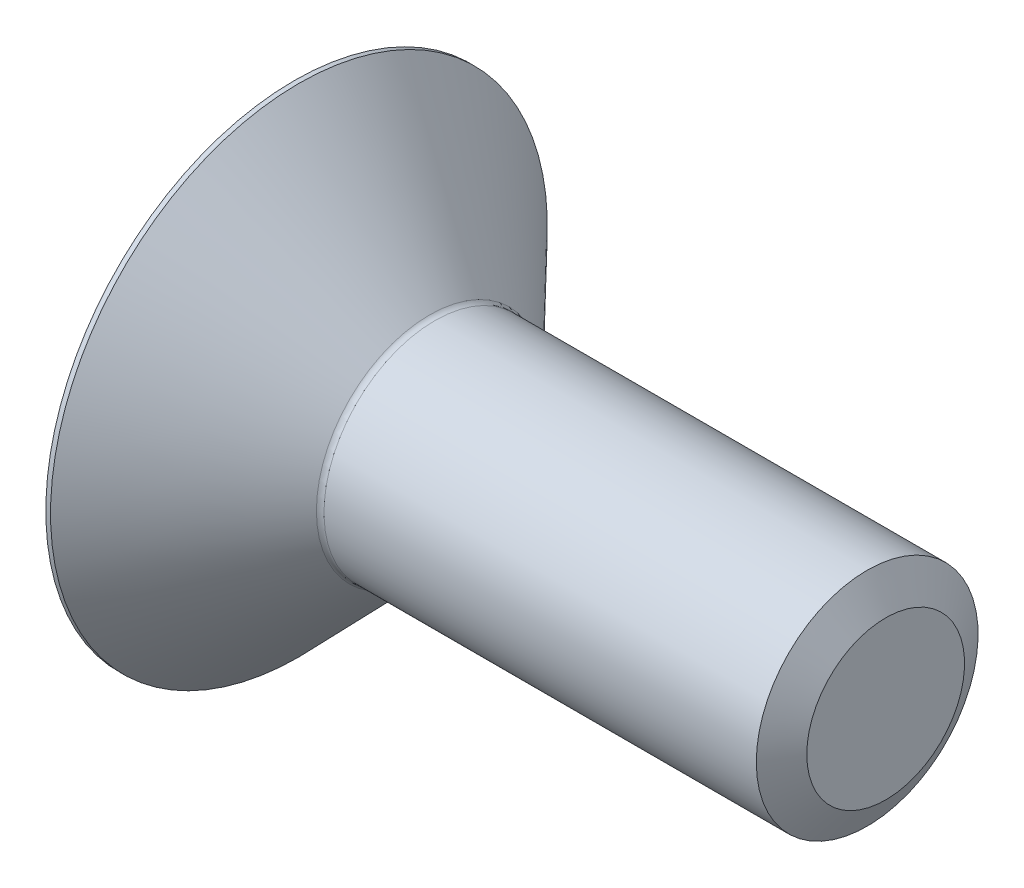
ISO-10303-21;
HEADER;
FILE_DESCRIPTION(('STEP AP214'),'2;1');
FILE_NAME('part.step','',(''),(''),'','','');
FILE_SCHEMA(('AUTOMOTIVE_DESIGN { 1 0 10303 214 1 1 1 1 }'));
ENDSEC;
DATA;
#1=APPLICATION_CONTEXT('core data for automotive mechanical design processes');
#2=APPLICATION_PROTOCOL_DEFINITION('international standard','automotive_design',2000,#1);
#3=PRODUCT_CONTEXT('',#1,'mechanical');
#4=PRODUCT('Part','Part','',(#3));
#5=PRODUCT_RELATED_PRODUCT_CATEGORY('part','',(#4));
#6=PRODUCT_DEFINITION_FORMATION('','',#4);
#7=PRODUCT_DEFINITION_CONTEXT('part definition',#1,'design');
#8=PRODUCT_DEFINITION('design','',#6,#7);
#9=PRODUCT_DEFINITION_SHAPE('','',#8);
#10=(LENGTH_UNIT() NAMED_UNIT(*) SI_UNIT(.MILLI.,.METRE.));
#11=(NAMED_UNIT(*) PLANE_ANGLE_UNIT() SI_UNIT($,.RADIAN.));
#12=(NAMED_UNIT(*) SI_UNIT($,.STERADIAN.) SOLID_ANGLE_UNIT());
#13=UNCERTAINTY_MEASURE_WITH_UNIT(LENGTH_MEASURE(1.E-05),#10,'distance_accuracy_value','');
#14=(GEOMETRIC_REPRESENTATION_CONTEXT(3) GLOBAL_UNCERTAINTY_ASSIGNED_CONTEXT((#13)) GLOBAL_UNIT_ASSIGNED_CONTEXT((#10,
#11,#12)) REPRESENTATION_CONTEXT('',''));
#15=CARTESIAN_POINT('',(0.,0.,0.));
#16=DIRECTION('',(0.,0.,1.));
#17=DIRECTION('',(1.,0.,0.));
#18=AXIS2_PLACEMENT_3D('',#15,#16,#17);
#19=CARTESIAN_POINT('',(0.,0.,0.));
#20=DIRECTION('',(1.,0.,0.));
#21=DIRECTION('',(0.,1.,0.));
#22=AXIS2_PLACEMENT_3D('',#19,#20,#21);
#23=CYLINDRICAL_SURFACE('',#22,1.5);
#24=CARTESIAN_POINT('',(-6.09755251837904,0.,0.));
#25=DIRECTION('',(1.,0.,0.));
#26=DIRECTION('',(0.,1.,0.));
#27=AXIS2_PLACEMENT_3D('',#24,#25,#26);
#28=CIRCLE('',#27,1.5);
#29=CARTESIAN_POINT('',(-6.09755251837904,1.5,0.));
#30=VERTEX_POINT('',#29);
#31=EDGE_CURVE('E134',#30,#30,#28,.T.);
#32=ORIENTED_EDGE('',*,*,#31,.T.);
#33=EDGE_LOOP('',(#32));
#34=FACE_BOUND('',#33,.T.);
#35=CARTESIAN_POINT('',(-0.25,0.,0.));
#36=DIRECTION('',(-1.,0.,0.));
#37=DIRECTION('',(0.,0.,1.));
#38=AXIS2_PLACEMENT_3D('',#35,#36,#37);
#39=CIRCLE('',#38,1.5);
#40=CARTESIAN_POINT('',(-0.25,0.,1.5));
#41=VERTEX_POINT('',#40);
#42=EDGE_CURVE('E322',#41,#41,#39,.T.);
#43=ORIENTED_EDGE('',*,*,#42,.T.);
#44=EDGE_LOOP('',(#43));
#45=FACE_BOUND('',#44,.T.);
#46=ADVANCED_FACE('F47',(#34,#45),#23,.T.);
#47=CARTESIAN_POINT('',(-8.,3.36,0.));
#48=DIRECTION('',(-1.,0.,0.));
#49=DIRECTION('',(0.,-1.,0.));
#50=AXIS2_PLACEMENT_3D('',#47,#48,#49);
#51=PLANE('',#50);
#52=CARTESIAN_POINT('',(-8.,0.,0.));
#53=DIRECTION('',(1.,0.,0.));
#54=DIRECTION('',(0.,1.,0.));
#55=AXIS2_PLACEMENT_3D('',#52,#53,#54);
#56=CIRCLE('',#55,3.36);
#57=CARTESIAN_POINT('',(-8.,3.36,0.));
#58=VERTEX_POINT('',#57);
#59=EDGE_CURVE('E225',#58,#58,#56,.T.);
#60=ORIENTED_EDGE('',*,*,#59,.F.);
#61=EDGE_LOOP('',(#60));
#62=FACE_BOUND('',#61,.T.);
#63=CARTESIAN_POINT('',(-8.,0.,0.));
#64=DIRECTION('',(-1.,0.,0.));
#65=DIRECTION('',(0.,-1.,0.));
#66=AXIS2_PLACEMENT_3D('',#63,#64,#65);
#67=CIRCLE('',#66,1.15470053837925);
#68=CARTESIAN_POINT('',(-8.,-0.577350269189627,1.));
#69=VERTEX_POINT('',#68);
#70=CARTESIAN_POINT('',(-8.,-1.15470053837925,0.));
#71=VERTEX_POINT('',#70);
#72=EDGE_CURVE('E51',#69,#71,#67,.F.);
#73=ORIENTED_EDGE('',*,*,#72,.T.);
#74=CARTESIAN_POINT('',(-8.,-0.577350269189627,-1.));
#75=VERTEX_POINT('',#74);
#76=EDGE_CURVE('E11',#71,#75,#67,.F.);
#77=ORIENTED_EDGE('',*,*,#76,.T.);
#78=CARTESIAN_POINT('',(-8.,0.577350269189627,-0.999999999999999));
#79=VERTEX_POINT('',#78);
#80=EDGE_CURVE('E56',#75,#79,#67,.F.);
#81=ORIENTED_EDGE('',*,*,#80,.T.);
#82=CARTESIAN_POINT('',(-8.,1.15470053837925,0.));
#83=VERTEX_POINT('',#82);
#84=EDGE_CURVE('E121',#79,#83,#67,.F.);
#85=ORIENTED_EDGE('',*,*,#84,.T.);
#86=CARTESIAN_POINT('',(-8.,0.,0.));
#87=DIRECTION('',(-1.,0.,0.));
#88=DIRECTION('',(0.,0.,1.));
#89=AXIS2_PLACEMENT_3D('',#86,#87,#88);
#90=CIRCLE('',#89,1.15470053837925);
#91=CARTESIAN_POINT('',(-8.,0.577350269189629,1.));
#92=VERTEX_POINT('',#91);
#93=EDGE_CURVE('E106',#92,#83,#90,.T.);
#94=ORIENTED_EDGE('',*,*,#93,.F.);
#95=EDGE_CURVE('E115',#92,#69,#67,.F.);
#96=ORIENTED_EDGE('',*,*,#95,.T.);
#97=EDGE_LOOP('',(#73,#77,#81,#85,#94,#96));
#98=FACE_BOUND('',#97,.T.);
#99=ADVANCED_FACE('F122',(#62,#98),#51,.T.);
#100=CARTESIAN_POINT('',(0.,0.,0.));
#101=DIRECTION('',(1.,0.,0.));
#102=DIRECTION('',(0.,1.,0.));
#103=AXIS2_PLACEMENT_3D('',#100,#101,#102);
#104=CYLINDRICAL_SURFACE('',#103,3.36);
#105=ORIENTED_EDGE('',*,*,#59,.T.);
#106=EDGE_LOOP('',(#105));
#107=FACE_BOUND('',#106,.T.);
#108=CARTESIAN_POINT('',(-7.93618112114115,0.,0.));
#109=DIRECTION('',(1.,0.,0.));
#110=DIRECTION('',(0.,1.,0.));
#111=AXIS2_PLACEMENT_3D('',#108,#109,#110);
#112=CIRCLE('',#111,3.36);
#113=CARTESIAN_POINT('',(-7.93618112114115,3.36,0.));
#114=VERTEX_POINT('',#113);
#115=EDGE_CURVE('E227',#114,#114,#112,.T.);
#116=ORIENTED_EDGE('',*,*,#115,.F.);
#117=EDGE_LOOP('',(#116));
#118=FACE_BOUND('',#117,.T.);
#119=ADVANCED_FACE('F213',(#107,#118),#104,.T.);
#120=CARTESIAN_POINT('',(-6.1694864984129,0.,0.));
#121=DIRECTION('',(-1.,0.,0.));
#122=DIRECTION('',(0.,-1.,0.));
#123=AXIS2_PLACEMENT_3D('',#120,#121,#122);
#124=CONICAL_SURFACE('',#123,1.5305341629541,0.802851455917394);
#125=ORIENTED_EDGE('',*,*,#115,.T.);
#126=EDGE_LOOP('',(#125));
#127=FACE_BOUND('',#126,.T.);
#128=CARTESIAN_POINT('',(-6.1694864984129,0.,0.));
#129=DIRECTION('',(1.,0.,0.));
#130=DIRECTION('',(0.,1.,0.));
#131=AXIS2_PLACEMENT_3D('',#128,#129,#130);
#132=CIRCLE('',#131,1.5305341629541);
#133=CARTESIAN_POINT('',(-6.1694864984129,1.5305341629541,0.));
#134=VERTEX_POINT('',#133);
#135=EDGE_CURVE('E231',#134,#134,#132,.T.);
#136=ORIENTED_EDGE('',*,*,#135,.F.);
#137=EDGE_LOOP('',(#136));
#138=FACE_BOUND('',#137,.T.);
#139=ADVANCED_FACE('F209',(#127,#138),#124,.T.);
#140=CARTESIAN_POINT('',(-6.09755251837904,0.,0.));
#141=DIRECTION('',(1.,0.,0.));
#142=DIRECTION('',(0.,1.,0.));
#143=AXIS2_PLACEMENT_3D('',#140,#141,#142);
#144=TOROIDAL_SURFACE('',#143,1.6,0.0999999999999989);
#145=ORIENTED_EDGE('',*,*,#135,.T.);
#146=EDGE_LOOP('',(#145));
#147=FACE_BOUND('',#146,.T.);
#148=ORIENTED_EDGE('',*,*,#31,.F.);
#149=EDGE_LOOP('',(#148));
#150=FACE_BOUND('',#149,.T.);
#151=ADVANCED_FACE('F205',(#147,#150),#144,.F.);
#152=CARTESIAN_POINT('',(-7.7,0.,0.));
#153=DIRECTION('',(-1.,0.,0.));
#154=DIRECTION('',(0.,0.,1.));
#155=AXIS2_PLACEMENT_3D('',#152,#153,#154);
#156=CONICAL_SURFACE('',#155,0.,1.31660847419537);
#157=CARTESIAN_POINT('',(-8.00003000449955,-0.577234799135788,1.0002));
#158=CARTESIAN_POINT('',(-7.99379291920422,-0.601225021738599,0.958647715567044));
#159=CARTESIAN_POINT('',(-7.98813137861672,-0.625256195021441,0.917024502475671));
#160=CARTESIAN_POINT('',(-7.97818542172232,-0.67339838633044,0.833639781140784));
#161=CARTESIAN_POINT('',(-7.9739015302713,-0.697509431260084,0.791878226299064));
#162=CARTESIAN_POINT('',(-7.96695890316674,-0.745673772514855,0.708455140132714));
#163=CARTESIAN_POINT('',(-7.9642923745456,-0.769726780462717,0.66679410829216));
#164=CARTESIAN_POINT('',(-7.96071689299408,-0.817861664223349,0.583422044002323));
#165=CARTESIAN_POINT('',(-7.95980762113533,-0.841943534003894,0.541711022001162));
#166=CARTESIAN_POINT('',(-7.95980762113533,-0.890107273564984,0.458288977998839));
#167=CARTESIAN_POINT('',(-7.96071689299408,-0.914189143345529,0.416577955997678));
#168=CARTESIAN_POINT('',(-7.9642923745456,-0.962324027106161,0.333205891707841));
#169=CARTESIAN_POINT('',(-7.96695890316674,-0.986377035054023,0.291544859867286));
#170=CARTESIAN_POINT('',(-7.9739015302713,-1.03454137630879,0.208121773700937));
#171=CARTESIAN_POINT('',(-7.97818542172232,-1.05865242123844,0.166360218859216));
#172=CARTESIAN_POINT('',(-7.98813137861672,-1.10679461254744,0.0829754975243295));
#173=CARTESIAN_POINT('',(-7.99379291920422,-1.13082578583028,0.0413522844329567));
#174=CARTESIAN_POINT('',(-8.00003000449955,-1.15481600843309,-0.000199999999999094));
#175=B_SPLINE_CURVE_WITH_KNOTS('',3,(#157,#158,#159,#160,#161,#162,#163,#164,#165,#166,#167,
#168,#169,#170,#171,#172,#173,#174),.UNSPECIFIED.,.F.,.F.,(4,2,2,2,2,2,2,2,4),(0.,
0.145159524820138,0.290374287087485,0.434883682122849,0.57936684736763,0.723850012612411,
0.868359407647776,1.01357416991512,1.15873369473526),.UNSPECIFIED.);
#176=EDGE_CURVE('E140',#69,#71,#175,.T.);
#177=ORIENTED_EDGE('',*,*,#176,.T.);
#178=ORIENTED_EDGE('',*,*,#72,.F.);
#179=EDGE_LOOP('',(#177,#178));
#180=FACE_BOUND('',#179,.T.);
#181=ADVANCED_FACE('F208',(#180),#156,.F.);
#182=CARTESIAN_POINT('',(-8.17013380617567,-1.50813004503231,1.));
#183=CARTESIAN_POINT('',(-8.16035504345823,-1.46296169551439,1.));
#184=CARTESIAN_POINT('',(-8.15070106343194,-1.41776633015547,1.));
#185=CARTESIAN_POINT('',(-8.13170572494957,-1.32730802004726,1.));
#186=CARTESIAN_POINT('',(-8.12236437980433,-1.28204507250605,1.));
#187=CARTESIAN_POINT('',(-8.094887707109,-1.1460540932135,1.));
#188=CARTESIAN_POINT('',(-8.07731859348705,-1.05520983554783,1.));
#189=CARTESIAN_POINT('',(-8.04461131203549,-0.873838301527072,1.));
#190=CARTESIAN_POINT('',(-8.02945456691833,-0.783314439111172,1.));
#191=CARTESIAN_POINT('',(-8.00260008692164,-0.60175454493786,1.));
#192=CARTESIAN_POINT('',(-7.99090169604683,-0.510718613654572,1.));
#193=CARTESIAN_POINT('',(-7.97246881045878,-0.32714728936339,1.));
#194=CARTESIAN_POINT('',(-7.96578776188202,-0.234606191530868,1.));
#195=CARTESIAN_POINT('',(-7.95903683627918,-0.0493046546038921,1.));
#196=CARTESIAN_POINT('',(-7.9589640024594,0.043455667820233,1.));
#197=CARTESIAN_POINT('',(-7.96545349339635,0.229083736297407,1.));
#198=CARTESIAN_POINT('',(-7.97204147369278,0.321950510989411,1.));
#199=CARTESIAN_POINT('',(-7.99045721398657,0.507192547661321,1.));
#200=CARTESIAN_POINT('',(-8.00228848161145,0.599567438647766,1.));
#201=CARTESIAN_POINT('',(-8.02981183130456,0.785811374344475,1.));
#202=CARTESIAN_POINT('',(-8.04558360306669,0.879668210998827,1.));
#203=CARTESIAN_POINT('',(-8.07952329667281,1.06695285350417,1.));
#204=CARTESIAN_POINT('',(-8.09769157871932,1.16038059267178,1.));
#205=CARTESIAN_POINT('',(-8.13558531630107,1.34694314919726,1.));
#206=CARTESIAN_POINT('',(-8.15531120297018,1.44007787798179,1.));
#207=CARTESIAN_POINT('',(-8.19579713229142,1.62612272763755,1.));
#208=CARTESIAN_POINT('',(-8.21655719605603,1.71903284388273,1.));
#209=CARTESIAN_POINT('',(-8.2585485742601,1.90363742744432,1.));
#210=CARTESIAN_POINT('',(-8.27977186890883,1.99533372655926,1.));
#211=CARTESIAN_POINT('',(-8.32271430579133,2.17861191601367,1.));
#212=CARTESIAN_POINT('',(-8.34443345858081,2.27019380387373,1.));
#213=CARTESIAN_POINT('',(-8.38820424202331,2.45314970796374,1.));
#214=CARTESIAN_POINT('',(-8.41025539433742,2.54452383886909,1.));
#215=CARTESIAN_POINT('',(-8.45463324718544,2.72720190599484,1.));
#216=CARTESIAN_POINT('',(-8.47695993829109,2.81850584450411,1.));
#217=CARTESIAN_POINT('',(-8.49938266952114,2.90978592143881,1.));
#218=B_SPLINE_CURVE_WITH_KNOTS('',3,(#182,#183,#184,#185,#186,#187,#188,#189,#190,#191,#192,
#193,#194,#195,#196,#197,#198,#199,#200,#201,#202,#203,#204,#205,#206,#207,#208,#209,#210,#211,
#212,#213,#214,#215,#216,#217),.UNSPECIFIED.,.F.,.F.,(4,2,2,2,2,2,2,2,2,2,2,2,2,2,2,2,2,4),(0.,
0.138643869889783,0.277293635233154,0.554857004517545,0.830167022781709,1.10542478551795,
1.38357462934898,1.66160001660696,1.94070037269332,2.2199877224158,2.50545939030146,
2.7909740144124,3.07656794584653,3.36216771000262,3.64452690710854,3.92689212062336,
4.20888343548739,4.49086512790399),.UNSPECIFIED.);
#219=EDGE_CURVE('E111',#92,#69,#218,.F.);
#220=ORIENTED_EDGE('',*,*,#219,.T.);
#221=ORIENTED_EDGE('',*,*,#95,.F.);
#222=EDGE_LOOP('',(#220,#221));
#223=FACE_BOUND('',#222,.T.);
#224=ADVANCED_FACE('F116',(#223),#156,.F.);
#225=CARTESIAN_POINT('',(-8.00003000449955,1.15481600843309,-0.000199999999999895));
#226=CARTESIAN_POINT('',(-7.99379291920422,1.13082578583028,0.041352284432956));
#227=CARTESIAN_POINT('',(-7.98813137861672,1.10679461254744,0.0829754975243288));
#228=CARTESIAN_POINT('',(-7.97818542172232,1.05865242123844,0.166360218859216));
#229=CARTESIAN_POINT('',(-7.9739015302713,1.03454137630879,0.208121773700936));
#230=CARTESIAN_POINT('',(-7.96695890316674,0.986377035054023,0.291544859867286));
#231=CARTESIAN_POINT('',(-7.9642923745456,0.962324027106161,0.333205891707841));
#232=CARTESIAN_POINT('',(-7.96071689299408,0.914189143345529,0.416577955997677));
#233=CARTESIAN_POINT('',(-7.95980762113533,0.890107273564985,0.458288977998839));
#234=CARTESIAN_POINT('',(-7.95980762113533,0.841943534003895,0.541711022001161));
#235=CARTESIAN_POINT('',(-7.96071689299408,0.81786166422335,0.583422044002323));
#236=CARTESIAN_POINT('',(-7.9642923745456,0.769726780462718,0.666794108292159));
#237=CARTESIAN_POINT('',(-7.96695890316674,0.745673772514856,0.708455140132714));
#238=CARTESIAN_POINT('',(-7.9739015302713,0.697509431260085,0.791878226299064));
#239=CARTESIAN_POINT('',(-7.97818542172232,0.67339838633044,0.833639781140784));
#240=CARTESIAN_POINT('',(-7.98813137861672,0.625256195021442,0.917024502475671));
#241=CARTESIAN_POINT('',(-7.99379291920422,0.6012250217386,0.958647715567044));
#242=CARTESIAN_POINT('',(-8.00003000449955,0.577234799135789,1.0002));
#243=B_SPLINE_CURVE_WITH_KNOTS('',3,(#225,#226,#227,#228,#229,#230,#231,#232,#233,#234,#235,
#236,#237,#238,#239,#240,#241,#242),.UNSPECIFIED.,.F.,.F.,(4,2,2,2,2,2,2,2,4),(0.,
0.145159524820137,0.290374287087485,0.434883682122849,0.57936684736763,0.723850012612411,
0.868359407647776,1.01357416991512,1.15873369473526),.UNSPECIFIED.);
#244=EDGE_CURVE('E102',#83,#92,#243,.T.);
#245=ORIENTED_EDGE('',*,*,#244,.T.);
#246=ORIENTED_EDGE('',*,*,#93,.T.);
#247=EDGE_LOOP('',(#245,#246));
#248=FACE_BOUND('',#247,.T.);
#249=ADVANCED_FACE('F104',(#248),#156,.F.);
#250=CARTESIAN_POINT('',(-8.00003000449955,0.577234799135789,-1.0002));
#251=CARTESIAN_POINT('',(-7.99379291920422,0.6012250217386,-0.958647715567043));
#252=CARTESIAN_POINT('',(-7.98813137861672,0.625256195021441,-0.91702450247567));
#253=CARTESIAN_POINT('',(-7.97818542172232,0.67339838633044,-0.833639781140783));
#254=CARTESIAN_POINT('',(-7.9739015302713,0.697509431260085,-0.791878226299063));
#255=CARTESIAN_POINT('',(-7.96695890316674,0.745673772514856,-0.708455140132713));
#256=CARTESIAN_POINT('',(-7.9642923745456,0.769726780462718,-0.666794108292159));
#257=CARTESIAN_POINT('',(-7.96071689299408,0.81786166422335,-0.583422044002322));
#258=CARTESIAN_POINT('',(-7.95980762113533,0.841943534003895,-0.541711022001161));
#259=CARTESIAN_POINT('',(-7.95980762113533,0.890107273564985,-0.458288977998838));
#260=CARTESIAN_POINT('',(-7.96071689299408,0.914189143345529,-0.416577955997677));
#261=CARTESIAN_POINT('',(-7.9642923745456,0.962324027106161,-0.33320589170784));
#262=CARTESIAN_POINT('',(-7.96695890316674,0.986377035054023,-0.291544859867286));
#263=CARTESIAN_POINT('',(-7.9739015302713,1.03454137630879,-0.208121773700936));
#264=CARTESIAN_POINT('',(-7.97818542172232,1.05865242123844,-0.166360218859216));
#265=CARTESIAN_POINT('',(-7.98813137861672,1.10679461254744,-0.0829754975243289));
#266=CARTESIAN_POINT('',(-7.99379291920422,1.13082578583028,-0.0413522844329561));
#267=CARTESIAN_POINT('',(-8.00003000449955,1.15481600843309,0.000199999999999834));
#268=B_SPLINE_CURVE_WITH_KNOTS('',3,(#250,#251,#252,#253,#254,#255,#256,#257,#258,#259,#260,
#261,#262,#263,#264,#265,#266,#267),.UNSPECIFIED.,.F.,.F.,(4,2,2,2,2,2,2,2,4),(0.,
0.145159524820137,0.290374287087485,0.434883682122849,0.57936684736763,0.723850012612411,
0.868359407647776,1.01357416991512,1.15873369473526),.UNSPECIFIED.);
#269=EDGE_CURVE('E124',#79,#83,#268,.T.);
#270=ORIENTED_EDGE('',*,*,#269,.T.);
#271=ORIENTED_EDGE('',*,*,#84,.F.);
#272=EDGE_LOOP('',(#270,#271));
#273=FACE_BOUND('',#272,.T.);
#274=ADVANCED_FACE('F305',(#273),#156,.F.);
#275=CARTESIAN_POINT('',(-8.17013380617567,-1.50813004503231,-0.999999999999999));
#276=CARTESIAN_POINT('',(-8.16035504345823,-1.46296169551439,-0.999999999999999));
#277=CARTESIAN_POINT('',(-8.15070106343194,-1.41776633015547,-0.999999999999999));
#278=CARTESIAN_POINT('',(-8.13170572494957,-1.32730802004726,-0.999999999999999));
#279=CARTESIAN_POINT('',(-8.12236437980433,-1.28204507250605,-0.999999999999999));
#280=CARTESIAN_POINT('',(-8.094887707109,-1.1460540932135,-0.999999999999999));
#281=CARTESIAN_POINT('',(-8.07731859348705,-1.05520983554783,-0.999999999999999));
#282=CARTESIAN_POINT('',(-8.04461131203549,-0.873838301527072,-0.999999999999999));
#283=CARTESIAN_POINT('',(-8.02945456691833,-0.783314439111172,-0.999999999999999));
#284=CARTESIAN_POINT('',(-8.00260008692164,-0.60175454493786,-0.999999999999999));
#285=CARTESIAN_POINT('',(-7.99090169604683,-0.510718613654572,-0.999999999999999));
#286=CARTESIAN_POINT('',(-7.97246881045878,-0.32714728936339,-0.999999999999999));
#287=CARTESIAN_POINT('',(-7.96578776188202,-0.234606191530869,-0.999999999999999));
#288=CARTESIAN_POINT('',(-7.95903683627918,-0.0493046546038923,-0.999999999999999));
#289=CARTESIAN_POINT('',(-7.9589640024594,0.0434556678202328,-0.999999999999999));
#290=CARTESIAN_POINT('',(-7.96545349339635,0.229083736297407,-0.999999999999999));
#291=CARTESIAN_POINT('',(-7.97204147369278,0.321950510989411,-0.999999999999999));
#292=CARTESIAN_POINT('',(-7.99045721398657,0.507192547661321,-0.999999999999999));
#293=CARTESIAN_POINT('',(-8.00228848161145,0.599567438647766,-0.999999999999999));
#294=CARTESIAN_POINT('',(-8.02981183130456,0.785811374344475,-0.999999999999999));
#295=CARTESIAN_POINT('',(-8.04558360306669,0.879668210998826,-0.999999999999999));
#296=CARTESIAN_POINT('',(-8.07952329667281,1.06695285350417,-0.999999999999999));
#297=CARTESIAN_POINT('',(-8.09769157871932,1.16038059267178,-0.999999999999999));
#298=CARTESIAN_POINT('',(-8.13558531630107,1.34694314919725,-0.999999999999999));
#299=CARTESIAN_POINT('',(-8.15531120297018,1.44007787798179,-0.999999999999999));
#300=CARTESIAN_POINT('',(-8.19579713229142,1.62612272763755,-0.999999999999999));
#301=CARTESIAN_POINT('',(-8.21655719605603,1.71903284388273,-0.999999999999999));
#302=CARTESIAN_POINT('',(-8.2585485742601,1.90363742744432,-0.999999999999999));
#303=CARTESIAN_POINT('',(-8.27977186890883,1.99533372655925,-0.999999999999999));
#304=CARTESIAN_POINT('',(-8.32271430579133,2.17861191601367,-0.999999999999999));
#305=CARTESIAN_POINT('',(-8.34443345858081,2.27019380387373,-0.999999999999999));
#306=CARTESIAN_POINT('',(-8.38820424202331,2.45314970796374,-0.999999999999999));
#307=CARTESIAN_POINT('',(-8.41025539433742,2.54452383886909,-0.999999999999999));
#308=CARTESIAN_POINT('',(-8.45463324718544,2.72720190599484,-0.999999999999999));
#309=CARTESIAN_POINT('',(-8.47695993829109,2.81850584450411,-0.999999999999999));
#310=CARTESIAN_POINT('',(-8.49938266952114,2.90978592143881,-0.999999999999999));
#311=B_SPLINE_CURVE_WITH_KNOTS('',3,(#275,#276,#277,#278,#279,#280,#281,#282,#283,#284,#285,
#286,#287,#288,#289,#290,#291,#292,#293,#294,#295,#296,#297,#298,#299,#300,#301,#302,#303,#304,
#305,#306,#307,#308,#309,#310),.UNSPECIFIED.,.F.,.F.,(4,2,2,2,2,2,2,2,2,2,2,2,2,2,2,2,2,4),(0.,
0.138643869889783,0.277293635233154,0.554857004517545,0.830167022781709,1.10542478551795,
1.38357462934898,1.66160001660696,1.94070037269332,2.2199877224158,2.50545939030146,
2.7909740144124,3.07656794584653,3.36216771000262,3.64452690710853,3.92689212062336,
4.20888343548739,4.49086512790399),.UNSPECIFIED.);
#312=EDGE_CURVE('E261',#75,#79,#311,.T.);
#313=ORIENTED_EDGE('',*,*,#312,.T.);
#314=ORIENTED_EDGE('',*,*,#80,.F.);
#315=EDGE_LOOP('',(#313,#314));
#316=FACE_BOUND('',#315,.T.);
#317=ADVANCED_FACE('F293',(#316),#156,.F.);
#318=CARTESIAN_POINT('',(-8.00003000449955,-1.15481600843309,0.000200000000000662));
#319=CARTESIAN_POINT('',(-7.99379291920422,-1.13082578583028,-0.0413522844329556));
#320=CARTESIAN_POINT('',(-7.98813137861672,-1.10679461254744,-0.0829754975243284));
#321=CARTESIAN_POINT('',(-7.97818542172232,-1.05865242123844,-0.166360218859215));
#322=CARTESIAN_POINT('',(-7.9739015302713,-1.03454137630879,-0.208121773700935));
#323=CARTESIAN_POINT('',(-7.96695890316674,-0.986377035054023,-0.291544859867285));
#324=CARTESIAN_POINT('',(-7.9642923745456,-0.962324027106161,-0.33320589170784));
#325=CARTESIAN_POINT('',(-7.96071689299408,-0.914189143345529,-0.416577955997677));
#326=CARTESIAN_POINT('',(-7.95980762113533,-0.890107273564984,-0.458288977998838));
#327=CARTESIAN_POINT('',(-7.95980762113533,-0.841943534003894,-0.541711022001161));
#328=CARTESIAN_POINT('',(-7.96071689299408,-0.817861664223349,-0.583422044002322));
#329=CARTESIAN_POINT('',(-7.9642923745456,-0.769726780462717,-0.666794108292159));
#330=CARTESIAN_POINT('',(-7.96695890316674,-0.745673772514856,-0.708455140132713));
#331=CARTESIAN_POINT('',(-7.9739015302713,-0.697509431260084,-0.791878226299063));
#332=CARTESIAN_POINT('',(-7.97818542172232,-0.67339838633044,-0.833639781140783));
#333=CARTESIAN_POINT('',(-7.98813137861672,-0.625256195021441,-0.91702450247567));
#334=CARTESIAN_POINT('',(-7.99379291920422,-0.6012250217386,-0.958647715567043));
#335=CARTESIAN_POINT('',(-8.00003000449955,-0.577234799135789,-1.0002));
#336=B_SPLINE_CURVE_WITH_KNOTS('',3,(#318,#319,#320,#321,#322,#323,#324,#325,#326,#327,#328,
#329,#330,#331,#332,#333,#334,#335),.UNSPECIFIED.,.F.,.F.,(4,2,2,2,2,2,2,2,4),(0.,
0.145159524820138,0.290374287087485,0.434883682122849,0.57936684736763,0.723850012612412,
0.868359407647776,1.01357416991512,1.15873369473526),.UNSPECIFIED.);
#337=EDGE_CURVE('E142',#71,#75,#336,.T.);
#338=ORIENTED_EDGE('',*,*,#337,.T.);
#339=ORIENTED_EDGE('',*,*,#76,.F.);
#340=EDGE_LOOP('',(#338,#339));
#341=FACE_BOUND('',#340,.T.);
#342=ADVANCED_FACE('F295',(#341),#156,.F.);
#343=CARTESIAN_POINT('',(-6.9,0.,0.));
#344=DIRECTION('',(-1.,0.,0.));
#345=DIRECTION('',(0.,0.,1.));
#346=AXIS2_PLACEMENT_3D('',#343,#344,#345);
#347=CONICAL_SURFACE('',#346,1.15470053837925,1.0471975511966);
#348=CARTESIAN_POINT('',(-6.23333333333334,0.,0.));
#349=VERTEX_POINT('',#348);
#350=VERTEX_LOOP('',#349);
#351=FACE_BOUND('',#350,.T.);
#352=CARTESIAN_POINT('',(-7.27183528873947,-1.49514512143374,1.));
#353=CARTESIAN_POINT('',(-7.25111502079343,-1.4519612611533,1.));
#354=CARTESIAN_POINT('',(-7.23061367234946,-1.40867282404237,1.));
#355=CARTESIAN_POINT('',(-7.1901634335246,-1.32182947914248,1.));
#356=CARTESIAN_POINT('',(-7.17021464256729,-1.27827452509756,1.));
#357=CARTESIAN_POINT('',(-7.11114515483648,-1.14662339890625,1.));
#358=CARTESIAN_POINT('',(-7.07305252653304,-1.05805724149109,1.));
#359=CARTESIAN_POINT('',(-7.00024582070057,-0.876833003172499,1.));
#360=CARTESIAN_POINT('',(-6.96564584045392,-0.784128452056497,1.));
#361=CARTESIAN_POINT('',(-6.90407347381845,-0.596331746532132,1.));
#362=CARTESIAN_POINT('',(-6.87708128484785,-0.501246505541257,1.));
#363=CARTESIAN_POINT('',(-6.84577577003502,-0.356699986452703,1.));
#364=CARTESIAN_POINT('',(-6.83687509854699,-0.30824416317171,1.));
#365=CARTESIAN_POINT('',(-6.82274243175691,-0.210788870695443,1.));
#366=CARTESIAN_POINT('',(-6.81751018853518,-0.161789438465743,1.));
#367=CARTESIAN_POINT('',(-6.81119898098177,-0.0641060489970666,1.));
#368=CARTESIAN_POINT('',(-6.81007100501111,-0.0154253461269776,1.));
#369=CARTESIAN_POINT('',(-6.81193297830514,0.0818553564032748,1.));
#370=CARTESIAN_POINT('',(-6.81492318255361,0.130455350879701,1.));
#371=CARTESIAN_POINT('',(-6.8271183217293,0.250369589613778,1.));
#372=CARTESIAN_POINT('',(-6.83860856098489,0.321451919115028,1.));
#373=CARTESIAN_POINT('',(-6.86824031739763,0.462229038490169,1.));
#374=CARTESIAN_POINT('',(-6.88638985094493,0.531922048861735,1.));
#375=CARTESIAN_POINT('',(-6.92786972268665,0.671415729806809,1.));
#376=CARTESIAN_POINT('',(-6.95130716830693,0.741183729418074,1.));
#377=CARTESIAN_POINT('',(-7.00156448824641,0.879438319396293,1.));
#378=CARTESIAN_POINT('',(-7.02838317523047,0.947925349932566,1.));
#379=CARTESIAN_POINT('',(-7.1000539154734,1.12214515906645,1.));
#380=CARTESIAN_POINT('',(-7.14657230519898,1.22718574040678,1.));
#381=CARTESIAN_POINT('',(-7.24287692224798,1.43575968104558,1.));
#382=CARTESIAN_POINT('',(-7.29266398782223,1.53929264533348,1.));
#383=CARTESIAN_POINT('',(-7.39433644453463,1.74546702338822,1.));
#384=CARTESIAN_POINT('',(-7.44622418186697,1.84810727553999,1.));
#385=CARTESIAN_POINT('',(-7.55133836883522,2.05270058021727,1.));
#386=CARTESIAN_POINT('',(-7.60456486267233,2.15465360991173,1.));
#387=CARTESIAN_POINT('',(-7.7068669169112,2.34846553091284,1.));
#388=CARTESIAN_POINT('',(-7.75585965896403,2.44036823161571,1.));
#389=CARTESIAN_POINT('',(-7.8544031328282,2.62387799005301,1.));
#390=CARTESIAN_POINT('',(-7.90395388528948,2.71548503668387,1.));
#391=CARTESIAN_POINT('',(-8.00334710767981,2.89823865557594,1.));
#392=CARTESIAN_POINT('',(-8.053188515041,2.98938580641156,1.));
#393=CARTESIAN_POINT('',(-8.15319572337612,3.17149583112622,1.));
#394=CARTESIAN_POINT('',(-8.20336150723714,3.26245871439935,1.));
#395=CARTESIAN_POINT('',(-8.25364621220496,3.35335539208176,1.));
#396=B_SPLINE_CURVE_WITH_KNOTS('',3,(#352,#353,#354,#355,#356,#357,#358,#359,#360,#361,#362,
#363,#364,#365,#366,#367,#368,#369,#370,#371,#372,#373,#374,#375,#376,#377,#378,#379,#380,#381,
#382,#383,#384,#385,#386,#387,#388,#389,#390,#391,#392,#393,#394,#395),.UNSPECIFIED.,.F.,.F.,(4,
2,2,2,2,2,2,2,2,2,2,2,2,2,2,2,2,2,2,2,2,4),(0.,0.14369034182065,0.287406372566274,
0.576560332877493,0.873259488934033,1.16917907000006,1.31686338831957,1.46453772487643,
1.61044269221659,1.75635669390452,1.97192533331898,2.18775432802314,2.40842600301166,
2.62902040304936,2.97355048126459,3.31816926186284,3.66318417395131,4.00821049225243,
4.32064609598597,4.63309330006989,4.94474578248761,5.25638195528641),.UNSPECIFIED.);
#397=CARTESIAN_POINT('',(-6.9,-0.577350269189626,1.));
#398=VERTEX_POINT('',#397);
#399=CARTESIAN_POINT('',(-6.9,0.577350269189627,1.));
#400=VERTEX_POINT('',#399);
#401=EDGE_CURVE('E174',#398,#400,#396,.T.);
#402=ORIENTED_EDGE('',*,*,#401,.T.);
#403=CARTESIAN_POINT('',(-6.90006667666567,0.577234799135789,1.0002));
#404=CARTESIAN_POINT('',(-6.88540897364915,0.602607795820549,0.95625268060172));
#405=CARTESIAN_POINT('',(-6.87207772362089,0.628199807531659,0.91192601605018));
#406=CARTESIAN_POINT('',(-6.84880650762345,0.679827098330832,0.822504925328878));
#407=CARTESIAN_POINT('',(-6.83887477654978,0.705863295614159,0.777408908798269));
#408=CARTESIAN_POINT('',(-6.82341269488208,0.757612978088369,0.687775829477381));
#409=CARTESIAN_POINT('',(-6.81777946809895,0.783318495222184,0.643252567766781));
#410=CARTESIAN_POINT('',(-6.81105128864025,0.834850648373672,0.553996260284983));
#411=CARTESIAN_POINT('',(-6.80995076792166,0.860677096749782,0.509263539518505));
#412=CARTESIAN_POINT('',(-6.81222505229814,0.908946264126691,0.425658889182653));
#413=CARTESIAN_POINT('',(-6.81504143886341,0.931396163287558,0.386774523211234));
#414=CARTESIAN_POINT('',(-6.82397245021735,0.976149681982094,0.309259155014814));
#415=CARTESIAN_POINT('',(-6.8300901337543,0.998453146411452,0.270628421438361));
#416=CARTESIAN_POINT('',(-6.84538572572582,1.04329913914046,0.192952883515855));
#417=CARTESIAN_POINT('',(-6.85462855216896,1.0658359836813,0.153917923728832));
#418=CARTESIAN_POINT('',(-6.87560684575553,1.11057330008463,0.076430618723988));
#419=CARTESIAN_POINT('',(-6.88733737513366,1.13277434629517,0.0379772787061409));
#420=CARTESIAN_POINT('',(-6.90006667666567,1.15481600843309,-0.000199999999999792));
#421=B_SPLINE_CURVE_WITH_KNOTS('',3,(#403,#404,#405,#406,#407,#408,#409,#410,#411,#412,#413,
#414,#415,#416,#417,#418,#419,#420),.UNSPECIFIED.,.F.,.F.,(4,2,2,2,2,2,2,2,4),(0.,
0.158523820030115,0.317428970089342,0.472400167924633,0.627180939971648,0.76201658487271,
0.896977373984232,1.03493410168667,1.17261952416172),.UNSPECIFIED.);
#422=CARTESIAN_POINT('',(-6.9,1.15470053837925,0.));
#423=VERTEX_POINT('',#422);
#424=EDGE_CURVE('E131',#400,#423,#421,.T.);
#425=ORIENTED_EDGE('',*,*,#424,.T.);
#426=CARTESIAN_POINT('',(-6.90006667666567,1.15481600843309,0.000200000000000105));
#427=CARTESIAN_POINT('',(-6.88540897364915,1.12944301174833,-0.04374731939828));
#428=CARTESIAN_POINT('',(-6.87207772362089,1.10385100003722,-0.0880739839498203));
#429=CARTESIAN_POINT('',(-6.84880650762345,1.05222370923805,-0.177495074671122));
#430=CARTESIAN_POINT('',(-6.83887477654978,1.02618751195472,-0.222591091201731));
#431=CARTESIAN_POINT('',(-6.82341269488208,0.974437829480511,-0.312224170522618));
#432=CARTESIAN_POINT('',(-6.81777946809895,0.948732312346696,-0.356747432233219));
#433=CARTESIAN_POINT('',(-6.81105128864025,0.897200159195208,-0.446003739715017));
#434=CARTESIAN_POINT('',(-6.80995076792166,0.871373710819098,-0.490736460481494));
#435=CARTESIAN_POINT('',(-6.81222505229814,0.823104543442189,-0.574341110817346));
#436=CARTESIAN_POINT('',(-6.81504143886341,0.800654644281322,-0.613225476788766));
#437=CARTESIAN_POINT('',(-6.82397245021735,0.755901125586786,-0.690740844985186));
#438=CARTESIAN_POINT('',(-6.8300901337543,0.733597661157428,-0.729371578561639));
#439=CARTESIAN_POINT('',(-6.84538572572582,0.68875166842842,-0.807047116484145));
#440=CARTESIAN_POINT('',(-6.85462855216896,0.666214823887577,-0.846082076271167));
#441=CARTESIAN_POINT('',(-6.87560684575553,0.621477507484251,-0.923569381276011));
#442=CARTESIAN_POINT('',(-6.88733737513366,0.599276461273707,-0.962022721293858));
#443=CARTESIAN_POINT('',(-6.90006667666567,0.577234799135789,-1.0002));
#444=B_SPLINE_CURVE_WITH_KNOTS('',3,(#426,#427,#428,#429,#430,#431,#432,#433,#434,#435,#436,
#437,#438,#439,#440,#441,#442,#443),.UNSPECIFIED.,.F.,.F.,(4,2,2,2,2,2,2,2,4),(0.,
0.158523820030115,0.317428970089342,0.472400167924633,0.627180939971648,0.76201658487271,
0.896977373984232,1.03493410168667,1.17261952416172),.UNSPECIFIED.);
#445=CARTESIAN_POINT('',(-6.9,0.577350269189626,-1.));
#446=VERTEX_POINT('',#445);
#447=EDGE_CURVE('E226',#423,#446,#444,.T.);
#448=ORIENTED_EDGE('',*,*,#447,.T.);
#449=CARTESIAN_POINT('',(-7.27183528873947,-1.49514512143374,-0.999999999999999));
#450=CARTESIAN_POINT('',(-7.25111502079343,-1.45196126115331,-0.999999999999999));
#451=CARTESIAN_POINT('',(-7.23061367234947,-1.40867282404237,-0.999999999999999));
#452=CARTESIAN_POINT('',(-7.1901634335246,-1.32182947914248,-0.999999999999999));
#453=CARTESIAN_POINT('',(-7.17021464256729,-1.27827452509756,-0.999999999999999));
#454=CARTESIAN_POINT('',(-7.11114515483648,-1.14662339890626,-0.999999999999999));
#455=CARTESIAN_POINT('',(-7.07305252653304,-1.05805724149109,-0.999999999999999));
#456=CARTESIAN_POINT('',(-7.00024582070057,-0.8768330031725,-0.999999999999999));
#457=CARTESIAN_POINT('',(-6.96564584045392,-0.784128452056499,-0.999999999999999));
#458=CARTESIAN_POINT('',(-6.90407347381845,-0.596331746532133,-0.999999999999999));
#459=CARTESIAN_POINT('',(-6.87708128484786,-0.501246505541258,-0.999999999999999));
#460=CARTESIAN_POINT('',(-6.84577577003502,-0.356699986452704,-0.999999999999999));
#461=CARTESIAN_POINT('',(-6.83687509854699,-0.30824416317171,-0.999999999999999));
#462=CARTESIAN_POINT('',(-6.82274243175691,-0.210788870695443,-0.999999999999999));
#463=CARTESIAN_POINT('',(-6.81751018853518,-0.161789438465743,-0.999999999999999));
#464=CARTESIAN_POINT('',(-6.81119898098177,-0.0641060489970667,-0.999999999999999));
#465=CARTESIAN_POINT('',(-6.8100710050111,-0.0154253461269777,-0.999999999999999));
#466=CARTESIAN_POINT('',(-6.81193297830514,0.0818553564032747,-0.999999999999999));
#467=CARTESIAN_POINT('',(-6.81492318255361,0.130455350879701,-0.999999999999999));
#468=CARTESIAN_POINT('',(-6.8271183217293,0.250369589613778,-0.999999999999999));
#469=CARTESIAN_POINT('',(-6.83860856098489,0.321451919115028,-0.999999999999999));
#470=CARTESIAN_POINT('',(-6.86824031739763,0.462229038490169,-0.999999999999999));
#471=CARTESIAN_POINT('',(-6.88638985094493,0.531922048861734,-0.999999999999999));
#472=CARTESIAN_POINT('',(-6.92786972268665,0.671415729806808,-0.999999999999999));
#473=CARTESIAN_POINT('',(-6.95130716830693,0.741183729418073,-0.999999999999999));
#474=CARTESIAN_POINT('',(-7.00156448824641,0.879438319396292,-0.999999999999999));
#475=CARTESIAN_POINT('',(-7.02838317523047,0.947925349932565,-0.999999999999999));
#476=CARTESIAN_POINT('',(-7.10005391547339,1.12214515906645,-0.999999999999999));
#477=CARTESIAN_POINT('',(-7.14657230519898,1.22718574040678,-0.999999999999999));
#478=CARTESIAN_POINT('',(-7.24287692224798,1.43575968104558,-0.999999999999999));
#479=CARTESIAN_POINT('',(-7.29266398782223,1.53929264533348,-0.999999999999999));
#480=CARTESIAN_POINT('',(-7.39433644453463,1.74546702338822,-0.999999999999999));
#481=CARTESIAN_POINT('',(-7.44622418186697,1.84810727553999,-0.999999999999999));
#482=CARTESIAN_POINT('',(-7.55133836883522,2.05270058021727,-0.999999999999999));
#483=CARTESIAN_POINT('',(-7.60456486267233,2.15465360991173,-0.999999999999999));
#484=CARTESIAN_POINT('',(-7.7068669169112,2.34846553091284,-0.999999999999999));
#485=CARTESIAN_POINT('',(-7.75585965896403,2.44036823161571,-0.999999999999999));
#486=CARTESIAN_POINT('',(-7.8544031328282,2.62387799005301,-0.999999999999999));
#487=CARTESIAN_POINT('',(-7.90395388528948,2.71548503668387,-0.999999999999999));
#488=CARTESIAN_POINT('',(-8.00334710767981,2.89823865557593,-0.999999999999999));
#489=CARTESIAN_POINT('',(-8.053188515041,2.98938580641156,-0.999999999999999));
#490=CARTESIAN_POINT('',(-8.15319572337611,3.17149583112622,-0.999999999999999));
#491=CARTESIAN_POINT('',(-8.20336150723714,3.26245871439935,-0.999999999999999));
#492=CARTESIAN_POINT('',(-8.25364621220495,3.35335539208176,-0.999999999999999));
#493=B_SPLINE_CURVE_WITH_KNOTS('',3,(#449,#450,#451,#452,#453,#454,#455,#456,#457,#458,#459,
#460,#461,#462,#463,#464,#465,#466,#467,#468,#469,#470,#471,#472,#473,#474,#475,#476,#477,#478,
#479,#480,#481,#482,#483,#484,#485,#486,#487,#488,#489,#490,#491,#492),.UNSPECIFIED.,.F.,.F.,(4,
2,2,2,2,2,2,2,2,2,2,2,2,2,2,2,2,2,2,2,2,4),(0.,0.14369034182065,0.287406372566273,
0.576560332877493,0.873259488934034,1.16917907000007,1.31686338831957,1.46453772487643,
1.61044269221659,1.75635669390452,1.97192533331898,2.18775432802314,2.40842600301166,
2.62902040304936,2.97355048126459,3.31816926186284,3.66318417395132,4.00821049225243,
4.32064609598597,4.63309330006989,4.94474578248761,5.25638195528641),.UNSPECIFIED.);
#494=CARTESIAN_POINT('',(-6.9,-0.577350269189627,-0.999999999999999));
#495=VERTEX_POINT('',#494);
#496=EDGE_CURVE('E110',#446,#495,#493,.F.);
#497=ORIENTED_EDGE('',*,*,#496,.T.);
#498=CARTESIAN_POINT('',(-6.90006667666567,-0.577234799135789,-1.0002));
#499=CARTESIAN_POINT('',(-6.88540897364915,-0.602607795820548,-0.956252680601719));
#500=CARTESIAN_POINT('',(-6.87207772362089,-0.628199807531658,-0.911926016050179));
#501=CARTESIAN_POINT('',(-6.84880650762345,-0.679827098330831,-0.822504925328877));
#502=CARTESIAN_POINT('',(-6.83887477654978,-0.705863295614158,-0.777408908798268));
#503=CARTESIAN_POINT('',(-6.82341269488208,-0.757612978088368,-0.68777582947738));
#504=CARTESIAN_POINT('',(-6.81777946809895,-0.783318495222183,-0.64325256776678));
#505=CARTESIAN_POINT('',(-6.81105128864025,-0.834850648373671,-0.553996260284982));
#506=CARTESIAN_POINT('',(-6.80995076792166,-0.860677096749781,-0.509263539518505));
#507=CARTESIAN_POINT('',(-6.81222505229814,-0.908946264126689,-0.425658889182653));
#508=CARTESIAN_POINT('',(-6.81504143886341,-0.931396163287557,-0.386774523211233));
#509=CARTESIAN_POINT('',(-6.82397245021735,-0.976149681982093,-0.309259155014813));
#510=CARTESIAN_POINT('',(-6.8300901337543,-0.998453146411451,-0.27062842143836));
#511=CARTESIAN_POINT('',(-6.84538572572582,-1.04329913914046,-0.192952883515854));
#512=CARTESIAN_POINT('',(-6.85462855216896,-1.0658359836813,-0.153917923728832));
#513=CARTESIAN_POINT('',(-6.87560684575553,-1.11057330008463,-0.0764306187239873));
#514=CARTESIAN_POINT('',(-6.88733737513366,-1.13277434629517,-0.0379772787061401));
#515=CARTESIAN_POINT('',(-6.90006667666567,-1.15481600843309,0.000200000000000573));
#516=B_SPLINE_CURVE_WITH_KNOTS('',3,(#498,#499,#500,#501,#502,#503,#504,#505,#506,#507,#508,
#509,#510,#511,#512,#513,#514,#515),.UNSPECIFIED.,.F.,.F.,(4,2,2,2,2,2,2,2,4),(0.,
0.158523820030115,0.317428970089342,0.472400167924632,0.627180939971647,0.76201658487271,
0.896977373984232,1.03493410168667,1.17261952416172),.UNSPECIFIED.);
#517=CARTESIAN_POINT('',(-6.9,-1.15470053837925,0.));
#518=VERTEX_POINT('',#517);
#519=EDGE_CURVE('E278',#495,#518,#516,.T.);
#520=ORIENTED_EDGE('',*,*,#519,.T.);
#521=CARTESIAN_POINT('',(-6.90006667666567,-1.15481600843309,-0.000199999999999432));
#522=CARTESIAN_POINT('',(-6.88540897364915,-1.12944301174833,0.0437473193982804));
#523=CARTESIAN_POINT('',(-6.87207772362089,-1.10385100003722,0.0880739839498208));
#524=CARTESIAN_POINT('',(-6.84880650762345,-1.05222370923805,0.177495074671122));
#525=CARTESIAN_POINT('',(-6.83887477654978,-1.02618751195472,0.222591091201732));
#526=CARTESIAN_POINT('',(-6.82341269488208,-0.97443782948051,0.312224170522619));
#527=CARTESIAN_POINT('',(-6.81777946809895,-0.948732312346695,0.35674743223322));
#528=CARTESIAN_POINT('',(-6.81105128864025,-0.897200159195207,0.446003739715018));
#529=CARTESIAN_POINT('',(-6.80995076792166,-0.871373710819097,0.490736460481495));
#530=CARTESIAN_POINT('',(-6.81222505229814,-0.823104543442188,0.574341110817347));
#531=CARTESIAN_POINT('',(-6.81504143886341,-0.800654644281321,0.613225476788766));
#532=CARTESIAN_POINT('',(-6.82397245021735,-0.755901125586785,0.690740844985186));
#533=CARTESIAN_POINT('',(-6.8300901337543,-0.733597661157427,0.729371578561639));
#534=CARTESIAN_POINT('',(-6.84538572572582,-0.68875166842842,0.807047116484145));
#535=CARTESIAN_POINT('',(-6.85462855216896,-0.666214823887576,0.846082076271168));
#536=CARTESIAN_POINT('',(-6.87560684575553,-0.62147750748425,0.923569381276012));
#537=CARTESIAN_POINT('',(-6.88733737513366,-0.599276461273706,0.962022721293859));
#538=CARTESIAN_POINT('',(-6.90006667666567,-0.577234799135788,1.0002));
#539=B_SPLINE_CURVE_WITH_KNOTS('',3,(#521,#522,#523,#524,#525,#526,#527,#528,#529,#530,#531,
#532,#533,#534,#535,#536,#537,#538),.UNSPECIFIED.,.F.,.F.,(4,2,2,2,2,2,2,2,4),(0.,
0.158523820030115,0.317428970089342,0.472400167924633,0.627180939971648,0.76201658487271,
0.896977373984232,1.03493410168667,1.17261952416172),.UNSPECIFIED.);
#540=EDGE_CURVE('E181',#518,#398,#539,.T.);
#541=ORIENTED_EDGE('',*,*,#540,.T.);
#542=EDGE_LOOP('',(#402,#425,#448,#497,#520,#541));
#543=FACE_BOUND('',#542,.T.);
#544=ADVANCED_FACE('F168',(#351,#543),#347,.F.);
#545=CARTESIAN_POINT('',(-6.14,1.15470053837925,0.));
#546=DIRECTION('',(0.,0.866025403784439,-0.5));
#547=DIRECTION('',(0.,0.5,0.866025403784439));
#548=AXIS2_PLACEMENT_3D('',#545,#546,#547);
#549=PLANE('',#548);
#550=ORIENTED_EDGE('',*,*,#269,.F.);
#551=DIRECTION('',(-1.,0.,0.));
#552=VECTOR('',#551,1.);
#553=CARTESIAN_POINT('',(-6.14,0.577350269189627,-0.999999999999999));
#554=LINE('',#553,#552);
#555=EDGE_CURVE('E244',#446,#79,#554,.T.);
#556=ORIENTED_EDGE('',*,*,#555,.F.);
#557=ORIENTED_EDGE('',*,*,#447,.F.);
#558=DIRECTION('',(-1.,0.,0.));
#559=VECTOR('',#558,1.);
#560=CARTESIAN_POINT('',(-6.14,1.15470053837925,0.));
#561=LINE('',#560,#559);
#562=EDGE_CURVE('E191',#423,#83,#561,.T.);
#563=ORIENTED_EDGE('',*,*,#562,.T.);
#564=EDGE_LOOP('',(#550,#556,#557,#563));
#565=FACE_BOUND('',#564,.T.);
#566=ADVANCED_FACE('F198',(#565),#549,.F.);
#567=CARTESIAN_POINT('',(-6.14,0.577350269189627,-0.999999999999999));
#568=DIRECTION('',(0.,0.,-1.));
#569=DIRECTION('',(-1.,0.,0.));
#570=AXIS2_PLACEMENT_3D('',#567,#568,#569);
#571=PLANE('',#570);
#572=ORIENTED_EDGE('',*,*,#312,.F.);
#573=DIRECTION('',(-1.,0.,0.));
#574=VECTOR('',#573,1.);
#575=CARTESIAN_POINT('',(-6.14,-0.577350269189626,-0.999999999999999));
#576=LINE('',#575,#574);
#577=EDGE_CURVE('E247',#495,#75,#576,.T.);
#578=ORIENTED_EDGE('',*,*,#577,.F.);
#579=ORIENTED_EDGE('',*,*,#496,.F.);
#580=ORIENTED_EDGE('',*,*,#555,.T.);
#581=EDGE_LOOP('',(#572,#578,#579,#580));
#582=FACE_BOUND('',#581,.T.);
#583=ADVANCED_FACE('F275',(#582),#571,.F.);
#584=CARTESIAN_POINT('',(-6.14,-0.577350269189626,-0.999999999999999));
#585=DIRECTION('',(0.,-0.866025403784439,-0.5));
#586=DIRECTION('',(0.,0.5,-0.866025403784439));
#587=AXIS2_PLACEMENT_3D('',#584,#585,#586);
#588=PLANE('',#587);
#589=ORIENTED_EDGE('',*,*,#337,.F.);
#590=DIRECTION('',(-1.,0.,0.));
#591=VECTOR('',#590,1.);
#592=CARTESIAN_POINT('',(-6.14,-1.15470053837925,0.));
#593=LINE('',#592,#591);
#594=EDGE_CURVE('E250',#518,#71,#593,.T.);
#595=ORIENTED_EDGE('',*,*,#594,.F.);
#596=ORIENTED_EDGE('',*,*,#519,.F.);
#597=ORIENTED_EDGE('',*,*,#577,.T.);
#598=EDGE_LOOP('',(#589,#595,#596,#597));
#599=FACE_BOUND('',#598,.T.);
#600=ADVANCED_FACE('F258',(#599),#588,.F.);
#601=CARTESIAN_POINT('',(-6.14,-1.15470053837925,0.));
#602=DIRECTION('',(0.,-0.866025403784439,0.5));
#603=DIRECTION('',(0.,-0.5,-0.866025403784439));
#604=AXIS2_PLACEMENT_3D('',#601,#602,#603);
#605=PLANE('',#604);
#606=ORIENTED_EDGE('',*,*,#176,.F.);
#607=DIRECTION('',(-1.,0.,0.));
#608=VECTOR('',#607,1.);
#609=CARTESIAN_POINT('',(-6.14,-0.577350269189626,1.));
#610=LINE('',#609,#608);
#611=EDGE_CURVE('E135',#398,#69,#610,.T.);
#612=ORIENTED_EDGE('',*,*,#611,.F.);
#613=ORIENTED_EDGE('',*,*,#540,.F.);
#614=ORIENTED_EDGE('',*,*,#594,.T.);
#615=EDGE_LOOP('',(#606,#612,#613,#614));
#616=FACE_BOUND('',#615,.T.);
#617=ADVANCED_FACE('F167',(#616),#605,.F.);
#618=CARTESIAN_POINT('',(-6.14,-0.577350269189626,1.));
#619=DIRECTION('',(0.,0.,1.));
#620=DIRECTION('',(1.,0.,0.));
#621=AXIS2_PLACEMENT_3D('',#618,#619,#620);
#622=PLANE('',#621);
#623=ORIENTED_EDGE('',*,*,#219,.F.);
#624=DIRECTION('',(-1.,0.,0.));
#625=VECTOR('',#624,1.);
#626=CARTESIAN_POINT('',(-6.14,0.577350269189627,1.));
#627=LINE('',#626,#625);
#628=EDGE_CURVE('E128',#400,#92,#627,.T.);
#629=ORIENTED_EDGE('',*,*,#628,.F.);
#630=ORIENTED_EDGE('',*,*,#401,.F.);
#631=ORIENTED_EDGE('',*,*,#611,.T.);
#632=EDGE_LOOP('',(#623,#629,#630,#631));
#633=FACE_BOUND('',#632,.T.);
#634=ADVANCED_FACE('F137',(#633),#622,.F.);
#635=CARTESIAN_POINT('',(-6.14,0.577350269189627,1.));
#636=DIRECTION('',(0.,0.866025403784439,0.5));
#637=DIRECTION('',(0.,-0.5,0.866025403784439));
#638=AXIS2_PLACEMENT_3D('',#635,#636,#637);
#639=PLANE('',#638);
#640=ORIENTED_EDGE('',*,*,#244,.F.);
#641=ORIENTED_EDGE('',*,*,#562,.F.);
#642=ORIENTED_EDGE('',*,*,#424,.F.);
#643=ORIENTED_EDGE('',*,*,#628,.T.);
#644=EDGE_LOOP('',(#640,#641,#642,#643));
#645=FACE_BOUND('',#644,.T.);
#646=ADVANCED_FACE('F129',(#645),#639,.F.);
#647=CARTESIAN_POINT('',(-0.25,0.,0.));
#648=DIRECTION('',(-1.,0.,0.));
#649=DIRECTION('',(0.,0.,1.));
#650=AXIS2_PLACEMENT_3D('',#647,#648,#649);
#651=CONICAL_SURFACE('',#650,1.5,1.0471975511966);
#652=CARTESIAN_POINT('',(0.,0.,0.));
#653=DIRECTION('',(-1.,0.,0.));
#654=DIRECTION('',(0.,0.,1.));
#655=AXIS2_PLACEMENT_3D('',#652,#653,#654);
#656=CIRCLE('',#655,1.06698729810778);
#657=CARTESIAN_POINT('',(0.,0.,1.06698729810778));
#658=VERTEX_POINT('',#657);
#659=EDGE_CURVE('E125',#658,#658,#656,.T.);
#660=ORIENTED_EDGE('',*,*,#659,.T.);
#661=EDGE_LOOP('',(#660));
#662=FACE_BOUND('',#661,.T.);
#663=ORIENTED_EDGE('',*,*,#42,.F.);
#664=EDGE_LOOP('',(#663));
#665=FACE_BOUND('',#664,.T.);
#666=ADVANCED_FACE('F197',(#662,#665),#651,.T.);
#667=CARTESIAN_POINT('',(0.,0.,0.));
#668=DIRECTION('',(1.,0.,0.));
#669=DIRECTION('',(0.,1.,0.));
#670=AXIS2_PLACEMENT_3D('',#667,#668,#669);
#671=PLANE('',#670);
#672=ORIENTED_EDGE('',*,*,#659,.F.);
#673=EDGE_LOOP('',(#672));
#674=FACE_BOUND('',#673,.T.);
#675=ADVANCED_FACE('F49',(#674),#671,.T.);
#676=CLOSED_SHELL('',(#46,#99,#119,#139,#151,#181,#224,#249,#274,#317,#342,#544,#566,#583,#600,
#617,#634,#646,#666,#675));
#677=MANIFOLD_SOLID_BREP('B2',#676);
#678=ADVANCED_BREP_SHAPE_REPRESENTATION('',(#18,#677),#14);
#679=SHAPE_DEFINITION_REPRESENTATION(#9,#678);
ENDSEC;
END-ISO-10303-21;
